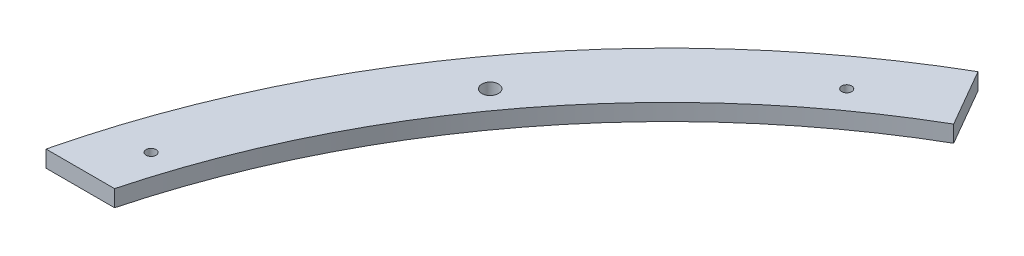
ISO-10303-21;
HEADER;
FILE_DESCRIPTION(('STEP AP214'),'2;1');
FILE_NAME('part.step','',(''),(''),'','','');
FILE_SCHEMA(('AUTOMOTIVE_DESIGN { 1 0 10303 214 1 1 1 1 }'));
ENDSEC;
DATA;
#1=APPLICATION_CONTEXT('core data for automotive mechanical design processes');
#2=APPLICATION_PROTOCOL_DEFINITION('international standard','automotive_design',2000,#1);
#3=PRODUCT_CONTEXT('',#1,'mechanical');
#4=PRODUCT('Part','Part','',(#3));
#5=PRODUCT_RELATED_PRODUCT_CATEGORY('part','',(#4));
#6=PRODUCT_DEFINITION_FORMATION('','',#4);
#7=PRODUCT_DEFINITION_CONTEXT('part definition',#1,'design');
#8=PRODUCT_DEFINITION('design','',#6,#7);
#9=PRODUCT_DEFINITION_SHAPE('','',#8);
#10=(LENGTH_UNIT() NAMED_UNIT(*) SI_UNIT(.MILLI.,.METRE.));
#11=(NAMED_UNIT(*) PLANE_ANGLE_UNIT() SI_UNIT($,.RADIAN.));
#12=(NAMED_UNIT(*) SI_UNIT($,.STERADIAN.) SOLID_ANGLE_UNIT());
#13=UNCERTAINTY_MEASURE_WITH_UNIT(LENGTH_MEASURE(1.E-05),#10,'distance_accuracy_value','');
#14=(GEOMETRIC_REPRESENTATION_CONTEXT(3) GLOBAL_UNCERTAINTY_ASSIGNED_CONTEXT((#13)) GLOBAL_UNIT_ASSIGNED_CONTEXT((#10,
#11,#12)) REPRESENTATION_CONTEXT('',''));
#15=CARTESIAN_POINT('',(0.,0.,0.));
#16=DIRECTION('',(0.,0.,1.));
#17=DIRECTION('',(1.,0.,0.));
#18=AXIS2_PLACEMENT_3D('',#15,#16,#17);
#19=CARTESIAN_POINT('',(0.,5.,0.));
#20=DIRECTION('',(0.,1.,0.));
#21=DIRECTION('',(0.,0.,1.));
#22=AXIS2_PLACEMENT_3D('',#19,#20,#21);
#23=PLANE('',#22);
#24=DIRECTION('',(0.499999999999998,0.,0.86602540378444));
#25=VECTOR('',#24,1.);
#26=CARTESIAN_POINT('',(0.,5.,0.));
#27=LINE('',#26,#25);
#28=CARTESIAN_POINT('',(-127.249999999999,5.,-220.40346526314));
#29=VERTEX_POINT('',#28);
#30=CARTESIAN_POINT('',(-117.25,5.,-203.082957187451));
#31=VERTEX_POINT('',#30);
#32=EDGE_CURVE('E47',#29,#31,#27,.T.);
#33=ORIENTED_EDGE('',*,*,#32,.F.);
#34=CARTESIAN_POINT('',(0.,5.,0.));
#35=DIRECTION('',(0.,1.,0.));
#36=DIRECTION('',(0.,0.,1.));
#37=AXIS2_PLACEMENT_3D('',#34,#35,#36);
#38=CIRCLE('',#37,254.5);
#39=CARTESIAN_POINT('',(-247.326201604278,5.,-60.));
#40=VERTEX_POINT('',#39);
#41=EDGE_CURVE('E41',#29,#40,#38,.T.);
#42=ORIENTED_EDGE('',*,*,#41,.T.);
#43=DIRECTION('',(-1.,0.,0.));
#44=VECTOR('',#43,1.);
#45=CARTESIAN_POINT('',(-226.694177252086,5.,-60.));
#46=LINE('',#45,#44);
#47=CARTESIAN_POINT('',(-226.694177252086,5.,-60.));
#48=VERTEX_POINT('',#47);
#49=EDGE_CURVE('E100',#48,#40,#46,.T.);
#50=ORIENTED_EDGE('',*,*,#49,.F.);
#51=CARTESIAN_POINT('',(0.,5.,0.));
#52=DIRECTION('',(0.,1.,0.));
#53=DIRECTION('',(0.,0.,1.));
#54=AXIS2_PLACEMENT_3D('',#51,#52,#53);
#55=CIRCLE('',#54,234.5);
#56=EDGE_CURVE('E85',#31,#48,#55,.T.);
#57=ORIENTED_EDGE('',*,*,#56,.F.);
#58=EDGE_LOOP('',(#33,#42,#50,#57));
#59=FACE_BOUND('',#58,.T.);
#60=CARTESIAN_POINT('',(-142.53792368093,5.,-196.186621135909));
#61=DIRECTION('',(0.,1.,0.));
#62=DIRECTION('',(0.,0.,1.));
#63=AXIS2_PLACEMENT_3D('',#60,#61,#62);
#64=CIRCLE('',#63,1.50000000000975);
#65=CARTESIAN_POINT('',(-142.53792368093,5.,-194.6866211359));
#66=VERTEX_POINT('',#65);
#67=EDGE_CURVE('E113',#66,#66,#64,.T.);
#68=ORIENTED_EDGE('',*,*,#67,.F.);
#69=EDGE_LOOP('',(#68));
#70=FACE_BOUND('',#69,.T.);
#71=CARTESIAN_POINT('',(-230.631205201575,5.,-74.9366211359056));
#72=DIRECTION('',(0.,1.,0.));
#73=DIRECTION('',(0.,0.,1.));
#74=AXIS2_PLACEMENT_3D('',#71,#72,#73);
#75=CIRCLE('',#74,1.50000000000615);
#76=CARTESIAN_POINT('',(-230.631205201575,5.,-73.4366211358995));
#77=VERTEX_POINT('',#76);
#78=EDGE_CURVE('E107',#77,#77,#75,.T.);
#79=ORIENTED_EDGE('',*,*,#78,.F.);
#80=EDGE_LOOP('',(#79));
#81=FACE_BOUND('',#80,.T.);
#82=CARTESIAN_POINT('',(-196.186621135925,5.,-142.537923680925));
#83=DIRECTION('',(0.,1.,0.));
#84=DIRECTION('',(0.,0.,1.));
#85=AXIS2_PLACEMENT_3D('',#82,#83,#84);
#86=CIRCLE('',#85,2.5);
#87=CARTESIAN_POINT('',(-196.186621135925,5.,-140.037923680925));
#88=VERTEX_POINT('',#87);
#89=EDGE_CURVE('E104',#88,#88,#86,.T.);
#90=ORIENTED_EDGE('',*,*,#89,.F.);
#91=EDGE_LOOP('',(#90));
#92=FACE_BOUND('',#91,.T.);
#93=ADVANCED_FACE('F33',(#59,#70,#81,#92),#23,.T.);
#94=CARTESIAN_POINT('',(0.,0.,0.));
#95=DIRECTION('',(0.,1.,0.));
#96=DIRECTION('',(0.,0.,1.));
#97=AXIS2_PLACEMENT_3D('',#94,#95,#96);
#98=PLANE('',#97);
#99=CARTESIAN_POINT('',(-142.53792368093,0.,-196.186621135909));
#100=DIRECTION('',(0.,1.,0.));
#101=DIRECTION('',(0.,0.,1.));
#102=AXIS2_PLACEMENT_3D('',#99,#100,#101);
#103=CIRCLE('',#102,1.50000000000975);
#104=CARTESIAN_POINT('',(-142.53792368093,0.,-194.6866211359));
#105=VERTEX_POINT('',#104);
#106=EDGE_CURVE('E110',#105,#105,#103,.T.);
#107=ORIENTED_EDGE('',*,*,#106,.T.);
#108=EDGE_LOOP('',(#107));
#109=FACE_BOUND('',#108,.T.);
#110=CARTESIAN_POINT('',(-230.631205201575,0.,-74.9366211359056));
#111=DIRECTION('',(0.,1.,0.));
#112=DIRECTION('',(0.,0.,1.));
#113=AXIS2_PLACEMENT_3D('',#110,#111,#112);
#114=CIRCLE('',#113,1.50000000000615);
#115=CARTESIAN_POINT('',(-230.631205201575,0.,-73.4366211358995));
#116=VERTEX_POINT('',#115);
#117=EDGE_CURVE('E116',#116,#116,#114,.T.);
#118=ORIENTED_EDGE('',*,*,#117,.T.);
#119=EDGE_LOOP('',(#118));
#120=FACE_BOUND('',#119,.T.);
#121=CARTESIAN_POINT('',(0.,0.,0.));
#122=DIRECTION('',(0.,1.,0.));
#123=DIRECTION('',(0.,0.,1.));
#124=AXIS2_PLACEMENT_3D('',#121,#122,#123);
#125=CIRCLE('',#124,254.5);
#126=CARTESIAN_POINT('',(-127.249999999999,0.,-220.40346526314));
#127=VERTEX_POINT('',#126);
#128=CARTESIAN_POINT('',(-247.326201604278,0.,-60.));
#129=VERTEX_POINT('',#128);
#130=EDGE_CURVE('E90',#127,#129,#125,.T.);
#131=ORIENTED_EDGE('',*,*,#130,.F.);
#132=DIRECTION('',(0.499999999999998,0.,0.86602540378444));
#133=VECTOR('',#132,1.);
#134=CARTESIAN_POINT('',(0.,0.,0.));
#135=LINE('',#134,#133);
#136=CARTESIAN_POINT('',(-117.25,0.,-203.082957187451));
#137=VERTEX_POINT('',#136);
#138=EDGE_CURVE('E75',#127,#137,#135,.T.);
#139=ORIENTED_EDGE('',*,*,#138,.T.);
#140=CARTESIAN_POINT('',(0.,0.,0.));
#141=DIRECTION('',(0.,1.,0.));
#142=DIRECTION('',(0.,0.,1.));
#143=AXIS2_PLACEMENT_3D('',#140,#141,#142);
#144=CIRCLE('',#143,234.5);
#145=CARTESIAN_POINT('',(-226.694177252086,0.,-60.));
#146=VERTEX_POINT('',#145);
#147=EDGE_CURVE('E55',#137,#146,#144,.T.);
#148=ORIENTED_EDGE('',*,*,#147,.T.);
#149=DIRECTION('',(-1.,0.,0.));
#150=VECTOR('',#149,1.);
#151=CARTESIAN_POINT('',(-226.694177252086,0.,-60.));
#152=LINE('',#151,#150);
#153=EDGE_CURVE('E99',#146,#129,#152,.T.);
#154=ORIENTED_EDGE('',*,*,#153,.T.);
#155=EDGE_LOOP('',(#131,#139,#148,#154));
#156=FACE_BOUND('',#155,.T.);
#157=CARTESIAN_POINT('',(-196.186621135925,0.,-142.537923680925));
#158=DIRECTION('',(0.,1.,0.));
#159=DIRECTION('',(0.,0.,1.));
#160=AXIS2_PLACEMENT_3D('',#157,#158,#159);
#161=CIRCLE('',#160,2.5);
#162=CARTESIAN_POINT('',(-196.186621135925,0.,-140.037923680925));
#163=VERTEX_POINT('',#162);
#164=EDGE_CURVE('E102',#163,#163,#161,.T.);
#165=ORIENTED_EDGE('',*,*,#164,.T.);
#166=EDGE_LOOP('',(#165));
#167=FACE_BOUND('',#166,.T.);
#168=ADVANCED_FACE('F121',(#109,#120,#156,#167),#98,.F.);
#169=CARTESIAN_POINT('',(0.,5.,0.));
#170=DIRECTION('',(0.,-1.,0.));
#171=DIRECTION('',(0.,0.,-1.));
#172=AXIS2_PLACEMENT_3D('',#169,#170,#171);
#173=CYLINDRICAL_SURFACE('',#172,254.5);
#174=ORIENTED_EDGE('',*,*,#41,.F.);
#175=DIRECTION('',(0.,1.,0.));
#176=VECTOR('',#175,1.);
#177=CARTESIAN_POINT('',(-127.249999999999,-5.,-220.40346526314));
#178=LINE('',#177,#176);
#179=EDGE_CURVE('E73',#127,#29,#178,.T.);
#180=ORIENTED_EDGE('',*,*,#179,.F.);
#181=ORIENTED_EDGE('',*,*,#130,.T.);
#182=DIRECTION('',(0.,-1.,0.));
#183=VECTOR('',#182,1.);
#184=CARTESIAN_POINT('',(-247.326201604278,5.,-60.));
#185=LINE('',#184,#183);
#186=EDGE_CURVE('E89',#129,#40,#185,.F.);
#187=ORIENTED_EDGE('',*,*,#186,.T.);
#188=EDGE_LOOP('',(#174,#180,#181,#187));
#189=FACE_BOUND('',#188,.T.);
#190=ADVANCED_FACE('F35',(#189),#173,.T.);
#191=CARTESIAN_POINT('',(0.,5.,0.));
#192=DIRECTION('',(0.,-1.,0.));
#193=DIRECTION('',(0.,0.,-1.));
#194=AXIS2_PLACEMENT_3D('',#191,#192,#193);
#195=CYLINDRICAL_SURFACE('',#194,234.5);
#196=DIRECTION('',(0.,-1.,0.));
#197=VECTOR('',#196,1.);
#198=CARTESIAN_POINT('',(-117.25,5.,-203.082957187451));
#199=LINE('',#198,#197);
#200=EDGE_CURVE('E11',#31,#137,#199,.T.);
#201=ORIENTED_EDGE('',*,*,#200,.F.);
#202=ORIENTED_EDGE('',*,*,#56,.T.);
#203=DIRECTION('',(0.,1.,0.));
#204=VECTOR('',#203,1.);
#205=CARTESIAN_POINT('',(-226.694177252086,0.,-60.));
#206=LINE('',#205,#204);
#207=EDGE_CURVE('E96',#146,#48,#206,.T.);
#208=ORIENTED_EDGE('',*,*,#207,.F.);
#209=ORIENTED_EDGE('',*,*,#147,.F.);
#210=EDGE_LOOP('',(#201,#202,#208,#209));
#211=FACE_BOUND('',#210,.T.);
#212=ADVANCED_FACE('F125',(#211),#195,.F.);
#213=CARTESIAN_POINT('',(-226.694177252086,0.,-60.));
#214=DIRECTION('',(0.,0.,-1.));
#215=DIRECTION('',(-1.,0.,0.));
#216=AXIS2_PLACEMENT_3D('',#213,#214,#215);
#217=PLANE('',#216);
#218=ORIENTED_EDGE('',*,*,#153,.F.);
#219=ORIENTED_EDGE('',*,*,#207,.T.);
#220=ORIENTED_EDGE('',*,*,#49,.T.);
#221=ORIENTED_EDGE('',*,*,#186,.F.);
#222=EDGE_LOOP('',(#218,#219,#220,#221));
#223=FACE_BOUND('',#222,.T.);
#224=ADVANCED_FACE('F127',(#223),#217,.F.);
#225=CARTESIAN_POINT('',(-196.186621135925,0.,-142.537923680925));
#226=DIRECTION('',(0.,1.,0.));
#227=DIRECTION('',(0.,0.,1.));
#228=AXIS2_PLACEMENT_3D('',#225,#226,#227);
#229=CYLINDRICAL_SURFACE('',#228,2.5);
#230=ORIENTED_EDGE('',*,*,#164,.F.);
#231=EDGE_LOOP('',(#230));
#232=FACE_BOUND('',#231,.T.);
#233=ORIENTED_EDGE('',*,*,#89,.T.);
#234=EDGE_LOOP('',(#233));
#235=FACE_BOUND('',#234,.T.);
#236=ADVANCED_FACE('F129',(#232,#235),#229,.F.);
#237=CARTESIAN_POINT('',(-230.631205201575,0.,-74.9366211359056));
#238=DIRECTION('',(0.,1.,0.));
#239=DIRECTION('',(0.,0.,1.));
#240=AXIS2_PLACEMENT_3D('',#237,#238,#239);
#241=CYLINDRICAL_SURFACE('',#240,1.50000000000615);
#242=ORIENTED_EDGE('',*,*,#117,.F.);
#243=EDGE_LOOP('',(#242));
#244=FACE_BOUND('',#243,.T.);
#245=ORIENTED_EDGE('',*,*,#78,.T.);
#246=EDGE_LOOP('',(#245));
#247=FACE_BOUND('',#246,.T.);
#248=ADVANCED_FACE('F135',(#244,#247),#241,.F.);
#249=CARTESIAN_POINT('',(-142.53792368093,0.,-196.186621135909));
#250=DIRECTION('',(0.,1.,0.));
#251=DIRECTION('',(0.,0.,1.));
#252=AXIS2_PLACEMENT_3D('',#249,#250,#251);
#253=CYLINDRICAL_SURFACE('',#252,1.50000000000975);
#254=ORIENTED_EDGE('',*,*,#106,.F.);
#255=EDGE_LOOP('',(#254));
#256=FACE_BOUND('',#255,.T.);
#257=ORIENTED_EDGE('',*,*,#67,.T.);
#258=EDGE_LOOP('',(#257));
#259=FACE_BOUND('',#258,.T.);
#260=ADVANCED_FACE('F156',(#256,#259),#253,.F.);
#261=CARTESIAN_POINT('',(0.,-5.,0.));
#262=DIRECTION('',(-0.86602540378444,0.,0.499999999999998));
#263=DIRECTION('',(0.499999999999998,0.,0.86602540378444));
#264=AXIS2_PLACEMENT_3D('',#261,#262,#263);
#265=PLANE('',#264);
#266=ORIENTED_EDGE('',*,*,#179,.T.);
#267=ORIENTED_EDGE('',*,*,#32,.T.);
#268=ORIENTED_EDGE('',*,*,#200,.T.);
#269=ORIENTED_EDGE('',*,*,#138,.F.);
#270=EDGE_LOOP('',(#266,#267,#268,#269));
#271=FACE_BOUND('',#270,.T.);
#272=ADVANCED_FACE('F74',(#271),#265,.F.);
#273=CLOSED_SHELL('',(#93,#168,#190,#212,#224,#236,#248,#260,#272));
#274=MANIFOLD_SOLID_BREP('B2',#273);
#275=ADVANCED_BREP_SHAPE_REPRESENTATION('',(#18,#274),#14);
#276=SHAPE_DEFINITION_REPRESENTATION(#9,#275);
ENDSEC;
END-ISO-10303-21;
